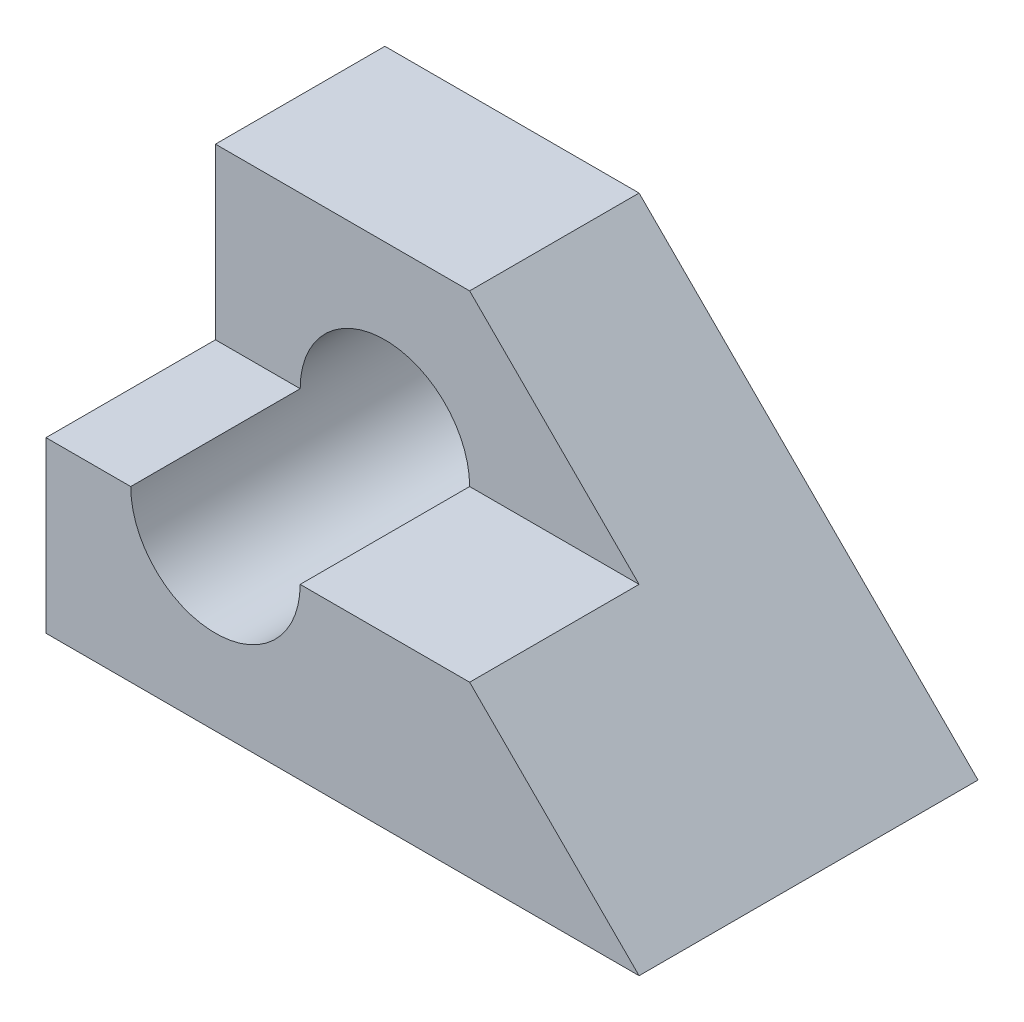
ISO-10303-21;
HEADER;
FILE_DESCRIPTION(('STEP AP214'),'2;1');
FILE_NAME('part.step','',(''),(''),'','','');
FILE_SCHEMA(('AUTOMOTIVE_DESIGN { 1 0 10303 214 1 1 1 1 }'));
ENDSEC;
DATA;
#1=APPLICATION_CONTEXT('core data for automotive mechanical design processes');
#2=APPLICATION_PROTOCOL_DEFINITION('international standard','automotive_design',2000,#1);
#3=PRODUCT_CONTEXT('',#1,'mechanical');
#4=PRODUCT('Part','Part','',(#3));
#5=PRODUCT_RELATED_PRODUCT_CATEGORY('part','',(#4));
#6=PRODUCT_DEFINITION_FORMATION('','',#4);
#7=PRODUCT_DEFINITION_CONTEXT('part definition',#1,'design');
#8=PRODUCT_DEFINITION('design','',#6,#7);
#9=PRODUCT_DEFINITION_SHAPE('','',#8);
#10=(LENGTH_UNIT() NAMED_UNIT(*) SI_UNIT(.MILLI.,.METRE.));
#11=(NAMED_UNIT(*) PLANE_ANGLE_UNIT() SI_UNIT($,.RADIAN.));
#12=(NAMED_UNIT(*) SI_UNIT($,.STERADIAN.) SOLID_ANGLE_UNIT());
#13=UNCERTAINTY_MEASURE_WITH_UNIT(LENGTH_MEASURE(1.E-05),#10,'distance_accuracy_value','');
#14=(GEOMETRIC_REPRESENTATION_CONTEXT(3) GLOBAL_UNCERTAINTY_ASSIGNED_CONTEXT((#13)) GLOBAL_UNIT_ASSIGNED_CONTEXT((#10,
#11,#12)) REPRESENTATION_CONTEXT('',''));
#15=CARTESIAN_POINT('',(0.,0.,0.));
#16=DIRECTION('',(0.,0.,1.));
#17=DIRECTION('',(1.,0.,0.));
#18=AXIS2_PLACEMENT_3D('',#15,#16,#17);
#19=CARTESIAN_POINT('',(-70.,20.,0.));
#20=DIRECTION('',(0.,1.,0.));
#21=DIRECTION('',(0.,0.,1.));
#22=AXIS2_PLACEMENT_3D('',#19,#20,#21);
#23=PLANE('',#22);
#24=DIRECTION('',(0.,0.,1.));
#25=VECTOR('',#24,1.);
#26=CARTESIAN_POINT('',(-20.,20.,0.));
#27=LINE('',#26,#25);
#28=CARTESIAN_POINT('',(-20.,20.,-20.));
#29=VERTEX_POINT('',#28);
#30=CARTESIAN_POINT('',(-20.,20.,0.));
#31=VERTEX_POINT('',#30);
#32=EDGE_CURVE('E161',#29,#31,#27,.T.);
#33=ORIENTED_EDGE('',*,*,#32,.F.);
#34=DIRECTION('',(1.,0.,0.));
#35=VECTOR('',#34,1.);
#36=CARTESIAN_POINT('',(-70.,20.,-20.));
#37=LINE('',#36,#35);
#38=CARTESIAN_POINT('',(-40.,20.,-20.));
#39=VERTEX_POINT('',#38);
#40=EDGE_CURVE('E106',#39,#29,#37,.T.);
#41=ORIENTED_EDGE('',*,*,#40,.F.);
#42=DIRECTION('',(0.,0.,-1.));
#43=VECTOR('',#42,1.);
#44=CARTESIAN_POINT('',(-40.,20.,30.));
#45=LINE('',#44,#43);
#46=CARTESIAN_POINT('',(-40.,20.,0.));
#47=VERTEX_POINT('',#46);
#48=EDGE_CURVE('E50',#47,#39,#45,.T.);
#49=ORIENTED_EDGE('',*,*,#48,.F.);
#50=DIRECTION('',(1.,0.,0.));
#51=VECTOR('',#50,1.);
#52=CARTESIAN_POINT('',(-70.,20.,0.));
#53=LINE('',#52,#51);
#54=EDGE_CURVE('E42',#47,#31,#53,.T.);
#55=ORIENTED_EDGE('',*,*,#54,.T.);
#56=EDGE_LOOP('',(#33,#41,#49,#55));
#57=FACE_BOUND('',#56,.T.);
#58=ADVANCED_FACE('F33',(#57),#23,.T.);
#59=CARTESIAN_POINT('',(-70.,0.,0.));
#60=DIRECTION('',(0.,0.,1.));
#61=DIRECTION('',(1.,0.,0.));
#62=AXIS2_PLACEMENT_3D('',#59,#60,#61);
#63=PLANE('',#62);
#64=DIRECTION('',(0.707106781186548,-0.707106781186548,0.));
#65=VECTOR('',#64,1.);
#66=CARTESIAN_POINT('',(-35.,35.,0.));
#67=LINE('',#66,#65);
#68=CARTESIAN_POINT('',(0.,0.,0.));
#69=VERTEX_POINT('',#68);
#70=EDGE_CURVE('E71',#31,#69,#67,.T.);
#71=ORIENTED_EDGE('',*,*,#70,.F.);
#72=ORIENTED_EDGE('',*,*,#54,.F.);
#73=CARTESIAN_POINT('',(-50.,20.,0.));
#74=DIRECTION('',(0.,0.,1.));
#75=DIRECTION('',(1.,0.,0.));
#76=AXIS2_PLACEMENT_3D('',#73,#74,#75);
#77=CIRCLE('',#76,9.99999999999999);
#78=CARTESIAN_POINT('',(-60.,20.,0.));
#79=VERTEX_POINT('',#78);
#80=EDGE_CURVE('E79',#79,#47,#77,.T.);
#81=ORIENTED_EDGE('',*,*,#80,.F.);
#82=CARTESIAN_POINT('',(-70.,20.,0.));
#83=VERTEX_POINT('',#82);
#84=EDGE_CURVE('E11',#83,#79,#53,.T.);
#85=ORIENTED_EDGE('',*,*,#84,.F.);
#86=DIRECTION('',(0.,-1.,0.));
#87=VECTOR('',#86,1.);
#88=CARTESIAN_POINT('',(-70.,0.,0.));
#89=LINE('',#88,#87);
#90=CARTESIAN_POINT('',(-70.,0.,0.));
#91=VERTEX_POINT('',#90);
#92=EDGE_CURVE('E128',#83,#91,#89,.T.);
#93=ORIENTED_EDGE('',*,*,#92,.T.);
#94=DIRECTION('',(1.,0.,0.));
#95=VECTOR('',#94,1.);
#96=CARTESIAN_POINT('',(-70.,0.,0.));
#97=LINE('',#96,#95);
#98=EDGE_CURVE('E37',#91,#69,#97,.T.);
#99=ORIENTED_EDGE('',*,*,#98,.T.);
#100=EDGE_LOOP('',(#71,#72,#81,#85,#93,#99));
#101=FACE_BOUND('',#100,.T.);
#102=ADVANCED_FACE('F35',(#101),#63,.T.);
#103=DIRECTION('',(0.,0.,-1.));
#104=VECTOR('',#103,1.);
#105=CARTESIAN_POINT('',(-60.,20.,30.));
#106=LINE('',#105,#104);
#107=CARTESIAN_POINT('',(-60.,20.,-20.));
#108=VERTEX_POINT('',#107);
#109=EDGE_CURVE('E166',#108,#79,#106,.F.);
#110=ORIENTED_EDGE('',*,*,#109,.F.);
#111=CARTESIAN_POINT('',(-70.,20.,-20.));
#112=VERTEX_POINT('',#111);
#113=EDGE_CURVE('E130',#112,#108,#37,.T.);
#114=ORIENTED_EDGE('',*,*,#113,.F.);
#115=DIRECTION('',(0.,0.,1.));
#116=VECTOR('',#115,1.);
#117=CARTESIAN_POINT('',(-70.,20.,0.));
#118=LINE('',#117,#116);
#119=EDGE_CURVE('E116',#112,#83,#118,.T.);
#120=ORIENTED_EDGE('',*,*,#119,.T.);
#121=ORIENTED_EDGE('',*,*,#84,.T.);
#122=EDGE_LOOP('',(#110,#114,#120,#121));
#123=FACE_BOUND('',#122,.T.);
#124=ADVANCED_FACE('F172',(#123),#23,.T.);
#125=CARTESIAN_POINT('',(-70.,40.,-20.));
#126=DIRECTION('',(0.,0.,1.));
#127=DIRECTION('',(0.,-1.,0.));
#128=AXIS2_PLACEMENT_3D('',#125,#126,#127);
#129=PLANE('',#128);
#130=DIRECTION('',(0.707106781186548,-0.707106781186548,0.));
#131=VECTOR('',#130,1.);
#132=CARTESIAN_POINT('',(-55.,55.,-20.));
#133=LINE('',#132,#131);
#134=CARTESIAN_POINT('',(-40.,40.,-20.));
#135=VERTEX_POINT('',#134);
#136=EDGE_CURVE('E102',#135,#29,#133,.T.);
#137=ORIENTED_EDGE('',*,*,#136,.F.);
#138=DIRECTION('',(1.,0.,0.));
#139=VECTOR('',#138,1.);
#140=CARTESIAN_POINT('',(-70.,40.,-20.));
#141=LINE('',#140,#139);
#142=CARTESIAN_POINT('',(-70.,40.,-20.));
#143=VERTEX_POINT('',#142);
#144=EDGE_CURVE('E93',#143,#135,#141,.T.);
#145=ORIENTED_EDGE('',*,*,#144,.F.);
#146=DIRECTION('',(0.,-1.,0.));
#147=VECTOR('',#146,1.);
#148=CARTESIAN_POINT('',(-70.,40.,-20.));
#149=LINE('',#148,#147);
#150=EDGE_CURVE('E97',#143,#112,#149,.T.);
#151=ORIENTED_EDGE('',*,*,#150,.T.);
#152=ORIENTED_EDGE('',*,*,#113,.T.);
#153=CARTESIAN_POINT('',(-50.,20.,-20.));
#154=DIRECTION('',(0.,0.,1.));
#155=DIRECTION('',(0.,-1.,0.));
#156=AXIS2_PLACEMENT_3D('',#153,#154,#155);
#157=CIRCLE('',#156,9.99999999999999);
#158=EDGE_CURVE('E164',#39,#108,#157,.T.);
#159=ORIENTED_EDGE('',*,*,#158,.F.);
#160=ORIENTED_EDGE('',*,*,#40,.T.);
#161=EDGE_LOOP('',(#137,#145,#151,#152,#159,#160));
#162=FACE_BOUND('',#161,.T.);
#163=ADVANCED_FACE('F95',(#162),#129,.T.);
#164=CARTESIAN_POINT('',(-70.,40.,-20.));
#165=DIRECTION('',(0.,1.,0.));
#166=DIRECTION('',(0.,0.,1.));
#167=AXIS2_PLACEMENT_3D('',#164,#165,#166);
#168=PLANE('',#167);
#169=DIRECTION('',(0.,0.,-1.));
#170=VECTOR('',#169,1.);
#171=CARTESIAN_POINT('',(-40.,40.,30.));
#172=LINE('',#171,#170);
#173=CARTESIAN_POINT('',(-40.,40.,-40.));
#174=VERTEX_POINT('',#173);
#175=EDGE_CURVE('E153',#135,#174,#172,.T.);
#176=ORIENTED_EDGE('',*,*,#175,.T.);
#177=DIRECTION('',(1.,0.,0.));
#178=VECTOR('',#177,1.);
#179=CARTESIAN_POINT('',(-70.,40.,-40.));
#180=LINE('',#179,#178);
#181=CARTESIAN_POINT('',(-70.,40.,-40.));
#182=VERTEX_POINT('',#181);
#183=EDGE_CURVE('E107',#182,#174,#180,.T.);
#184=ORIENTED_EDGE('',*,*,#183,.F.);
#185=DIRECTION('',(0.,0.,1.));
#186=VECTOR('',#185,1.);
#187=CARTESIAN_POINT('',(-70.,40.,-20.));
#188=LINE('',#187,#186);
#189=EDGE_CURVE('E113',#182,#143,#188,.T.);
#190=ORIENTED_EDGE('',*,*,#189,.T.);
#191=ORIENTED_EDGE('',*,*,#144,.T.);
#192=EDGE_LOOP('',(#176,#184,#190,#191));
#193=FACE_BOUND('',#192,.T.);
#194=ADVANCED_FACE('F118',(#193),#168,.T.);
#195=CARTESIAN_POINT('',(-70.,0.,-40.));
#196=DIRECTION('',(0.,0.,-1.));
#197=DIRECTION('',(-1.,0.,0.));
#198=AXIS2_PLACEMENT_3D('',#195,#196,#197);
#199=PLANE('',#198);
#200=DIRECTION('',(-0.707106781186548,0.707106781186548,0.));
#201=VECTOR('',#200,1.);
#202=CARTESIAN_POINT('',(0.,0.,-40.));
#203=LINE('',#202,#201);
#204=CARTESIAN_POINT('',(0.,0.,-40.));
#205=VERTEX_POINT('',#204);
#206=EDGE_CURVE('E148',#205,#174,#203,.T.);
#207=ORIENTED_EDGE('',*,*,#206,.F.);
#208=DIRECTION('',(1.,0.,0.));
#209=VECTOR('',#208,1.);
#210=CARTESIAN_POINT('',(-70.,0.,-40.));
#211=LINE('',#210,#209);
#212=CARTESIAN_POINT('',(-70.,0.,-40.));
#213=VERTEX_POINT('',#212);
#214=EDGE_CURVE('E132',#213,#205,#211,.T.);
#215=ORIENTED_EDGE('',*,*,#214,.F.);
#216=DIRECTION('',(0.,1.,0.));
#217=VECTOR('',#216,1.);
#218=CARTESIAN_POINT('',(-70.,0.,-40.));
#219=LINE('',#218,#217);
#220=EDGE_CURVE('E120',#213,#182,#219,.T.);
#221=ORIENTED_EDGE('',*,*,#220,.T.);
#222=ORIENTED_EDGE('',*,*,#183,.T.);
#223=EDGE_LOOP('',(#207,#215,#221,#222));
#224=FACE_BOUND('',#223,.T.);
#225=CARTESIAN_POINT('',(-50.,20.,-40.));
#226=DIRECTION('',(0.,0.,-1.));
#227=DIRECTION('',(-1.,0.,0.));
#228=AXIS2_PLACEMENT_3D('',#225,#226,#227);
#229=CIRCLE('',#228,9.99999999999999);
#230=CARTESIAN_POINT('',(-60.,20.,-40.));
#231=VERTEX_POINT('',#230);
#232=EDGE_CURVE('E155',#231,#231,#229,.T.);
#233=ORIENTED_EDGE('',*,*,#232,.F.);
#234=EDGE_LOOP('',(#233));
#235=FACE_BOUND('',#234,.T.);
#236=ADVANCED_FACE('F151',(#224,#235),#199,.T.);
#237=CARTESIAN_POINT('',(-70.,0.,0.));
#238=DIRECTION('',(0.,-1.,0.));
#239=DIRECTION('',(0.,0.,-1.));
#240=AXIS2_PLACEMENT_3D('',#237,#238,#239);
#241=PLANE('',#240);
#242=DIRECTION('',(0.,0.,-1.));
#243=VECTOR('',#242,1.);
#244=CARTESIAN_POINT('',(0.,0.,0.));
#245=LINE('',#244,#243);
#246=EDGE_CURVE('E127',#69,#205,#245,.T.);
#247=ORIENTED_EDGE('',*,*,#246,.F.);
#248=ORIENTED_EDGE('',*,*,#98,.F.);
#249=DIRECTION('',(0.,0.,-1.));
#250=VECTOR('',#249,1.);
#251=CARTESIAN_POINT('',(-70.,0.,0.));
#252=LINE('',#251,#250);
#253=EDGE_CURVE('E122',#91,#213,#252,.T.);
#254=ORIENTED_EDGE('',*,*,#253,.T.);
#255=ORIENTED_EDGE('',*,*,#214,.T.);
#256=EDGE_LOOP('',(#247,#248,#254,#255));
#257=FACE_BOUND('',#256,.T.);
#258=ADVANCED_FACE('F142',(#257),#241,.T.);
#259=CARTESIAN_POINT('',(-70.,0.,0.));
#260=DIRECTION('',(-1.,0.,0.));
#261=DIRECTION('',(0.,0.,1.));
#262=AXIS2_PLACEMENT_3D('',#259,#260,#261);
#263=PLANE('',#262);
#264=ORIENTED_EDGE('',*,*,#92,.F.);
#265=ORIENTED_EDGE('',*,*,#119,.F.);
#266=ORIENTED_EDGE('',*,*,#150,.F.);
#267=ORIENTED_EDGE('',*,*,#189,.F.);
#268=ORIENTED_EDGE('',*,*,#220,.F.);
#269=ORIENTED_EDGE('',*,*,#253,.F.);
#270=EDGE_LOOP('',(#264,#265,#266,#267,#268,#269));
#271=FACE_BOUND('',#270,.T.);
#272=ADVANCED_FACE('F111',(#271),#263,.T.);
#273=CARTESIAN_POINT('',(0.,0.,30.));
#274=DIRECTION('',(-0.707106781186548,-0.707106781186548,0.));
#275=DIRECTION('',(0.707106781186548,-0.707106781186548,0.));
#276=AXIS2_PLACEMENT_3D('',#273,#274,#275);
#277=PLANE('',#276);
#278=ORIENTED_EDGE('',*,*,#70,.T.);
#279=ORIENTED_EDGE('',*,*,#246,.T.);
#280=ORIENTED_EDGE('',*,*,#206,.T.);
#281=ORIENTED_EDGE('',*,*,#175,.F.);
#282=ORIENTED_EDGE('',*,*,#136,.T.);
#283=ORIENTED_EDGE('',*,*,#32,.T.);
#284=EDGE_LOOP('',(#278,#279,#280,#281,#282,#283));
#285=FACE_BOUND('',#284,.T.);
#286=ADVANCED_FACE('F145',(#285),#277,.F.);
#287=CARTESIAN_POINT('',(-50.,20.,30.));
#288=DIRECTION('',(0.,0.,-1.));
#289=DIRECTION('',(-1.,0.,0.));
#290=AXIS2_PLACEMENT_3D('',#287,#288,#289);
#291=CYLINDRICAL_SURFACE('',#290,9.99999999999999);
#292=ORIENTED_EDGE('',*,*,#80,.T.);
#293=ORIENTED_EDGE('',*,*,#48,.T.);
#294=ORIENTED_EDGE('',*,*,#158,.T.);
#295=ORIENTED_EDGE('',*,*,#109,.T.);
#296=EDGE_LOOP('',(#292,#293,#294,#295));
#297=FACE_BOUND('',#296,.T.);
#298=ORIENTED_EDGE('',*,*,#232,.T.);
#299=EDGE_LOOP('',(#298));
#300=FACE_BOUND('',#299,.T.);
#301=ADVANCED_FACE('F205',(#297,#300),#291,.F.);
#302=CLOSED_SHELL('',(#58,#102,#124,#163,#194,#236,#258,#272,#286,#301));
#303=MANIFOLD_SOLID_BREP('B2',#302);
#304=ADVANCED_BREP_SHAPE_REPRESENTATION('',(#18,#303),#14);
#305=SHAPE_DEFINITION_REPRESENTATION(#9,#304);
ENDSEC;
END-ISO-10303-21;
